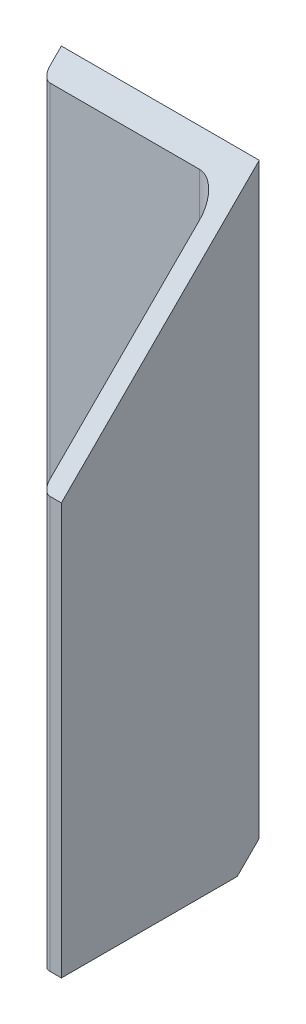
ISO-10303-21;
HEADER;
FILE_DESCRIPTION(('STEP AP214'),'2;1');
FILE_NAME('part.step','',(''),(''),'','','');
FILE_SCHEMA(('AUTOMOTIVE_DESIGN { 1 0 10303 214 1 1 1 1 }'));
ENDSEC;
DATA;
#1=APPLICATION_CONTEXT('core data for automotive mechanical design processes');
#2=APPLICATION_PROTOCOL_DEFINITION('international standard','automotive_design',2000,#1);
#3=PRODUCT_CONTEXT('',#1,'mechanical');
#4=PRODUCT('Part','Part','',(#3));
#5=PRODUCT_RELATED_PRODUCT_CATEGORY('part','',(#4));
#6=PRODUCT_DEFINITION_FORMATION('','',#4);
#7=PRODUCT_DEFINITION_CONTEXT('part definition',#1,'design');
#8=PRODUCT_DEFINITION('design','',#6,#7);
#9=PRODUCT_DEFINITION_SHAPE('','',#8);
#10=(LENGTH_UNIT() NAMED_UNIT(*) SI_UNIT(.MILLI.,.METRE.));
#11=(NAMED_UNIT(*) PLANE_ANGLE_UNIT() SI_UNIT($,.RADIAN.));
#12=(NAMED_UNIT(*) SI_UNIT($,.STERADIAN.) SOLID_ANGLE_UNIT());
#13=UNCERTAINTY_MEASURE_WITH_UNIT(LENGTH_MEASURE(1.E-05),#10,'distance_accuracy_value','');
#14=(GEOMETRIC_REPRESENTATION_CONTEXT(3) GLOBAL_UNCERTAINTY_ASSIGNED_CONTEXT((#13)) GLOBAL_UNIT_ASSIGNED_CONTEXT((#10,
#11,#12)) REPRESENTATION_CONTEXT('',''));
#15=CARTESIAN_POINT('',(0.,0.,0.));
#16=DIRECTION('',(0.,0.,1.));
#17=DIRECTION('',(1.,0.,0.));
#18=AXIS2_PLACEMENT_3D('',#15,#16,#17);
#19=CARTESIAN_POINT('',(-29.1999999999999,5.9999999999999,-490.3));
#20=DIRECTION('',(0.,1.,0.));
#21=DIRECTION('',(0.,0.,-1.));
#22=AXIS2_PLACEMENT_3D('',#19,#20,#21);
#23=PLANE('',#22);
#24=DIRECTION('',(0.,0.,1.));
#25=VECTOR('',#24,1.);
#26=CARTESIAN_POINT('',(31.5000000000001,5.99999999999989,-494.));
#27=LINE('',#26,#25);
#28=CARTESIAN_POINT('',(31.5,5.99999999999991,-487.));
#29=VERTEX_POINT('',#28);
#30=CARTESIAN_POINT('',(31.4999999999996,6.,-431.));
#31=VERTEX_POINT('',#30);
#32=EDGE_CURVE('E118',#29,#31,#27,.T.);
#33=ORIENTED_EDGE('',*,*,#32,.T.);
#34=DIRECTION('',(-1.,0.,0.));
#35=VECTOR('',#34,1.);
#36=CARTESIAN_POINT('',(27.7999999999996,6.,-431.));
#37=LINE('',#36,#35);
#38=CARTESIAN_POINT('',(27.7999999999996,6.,-431.));
#39=VERTEX_POINT('',#38);
#40=EDGE_CURVE('E127',#31,#39,#37,.T.);
#41=ORIENTED_EDGE('',*,*,#40,.T.);
#42=CARTESIAN_POINT('',(27.7999999999997,6.,-433.3));
#43=DIRECTION('',(0.,-1.,0.));
#44=DIRECTION('',(0.,0.,1.));
#45=AXIS2_PLACEMENT_3D('',#42,#43,#44);
#46=CIRCLE('',#45,2.30000000000001);
#47=CARTESIAN_POINT('',(25.4999999999996,6.,-433.3));
#48=VERTEX_POINT('',#47);
#49=EDGE_CURVE('E133',#39,#48,#46,.T.);
#50=ORIENTED_EDGE('',*,*,#49,.T.);
#51=DIRECTION('',(0.,0.,-1.));
#52=VECTOR('',#51,1.);
#53=CARTESIAN_POINT('',(25.5,5.99999999999992,-481.));
#54=LINE('',#53,#52);
#55=CARTESIAN_POINT('',(25.5,5.99999999999992,-481.));
#56=VERTEX_POINT('',#55);
#57=EDGE_CURVE('E145',#48,#56,#54,.T.);
#58=ORIENTED_EDGE('',*,*,#57,.T.);
#59=CARTESIAN_POINT('',(18.5,5.99999999999992,-481.));
#60=DIRECTION('',(0.,1.,0.));
#61=DIRECTION('',(0.,0.,-1.));
#62=AXIS2_PLACEMENT_3D('',#59,#60,#61);
#63=CIRCLE('',#62,7.);
#64=CARTESIAN_POINT('',(22.1055512754641,5.99999999999991,-487.));
#65=VERTEX_POINT('',#64);
#66=EDGE_CURVE('E148',#56,#65,#63,.T.);
#67=ORIENTED_EDGE('',*,*,#66,.T.);
#68=DIRECTION('',(-1.,0.,0.));
#69=VECTOR('',#68,1.);
#70=CARTESIAN_POINT('',(-29.2,5.99999999999991,-487.));
#71=LINE('',#70,#69);
#72=EDGE_CURVE('E138',#29,#65,#71,.T.);
#73=ORIENTED_EDGE('',*,*,#72,.F.);
#74=EDGE_LOOP('',(#33,#41,#50,#58,#67,#73));
#75=FACE_BOUND('',#74,.T.);
#76=ADVANCED_FACE('F36',(#75),#23,.F.);
#77=CARTESIAN_POINT('',(-29.1999999999999,200.,-490.3));
#78=DIRECTION('',(0.,-1.,0.));
#79=DIRECTION('',(0.,0.,1.));
#80=AXIS2_PLACEMENT_3D('',#77,#78,#79);
#81=CYLINDRICAL_SURFACE('',#80,2.29999999999998);
#82=DIRECTION('',(0.,-1.,0.));
#83=VECTOR('',#82,1.);
#84=CARTESIAN_POINT('',(-29.2,200.,-488.));
#85=LINE('',#84,#83);
#86=CARTESIAN_POINT('',(-29.2,194.000000000001,-488.));
#87=VERTEX_POINT('',#86);
#88=CARTESIAN_POINT('',(-29.2,6.99999999999995,-488.));
#89=VERTEX_POINT('',#88);
#90=EDGE_CURVE('E153',#87,#89,#85,.T.);
#91=ORIENTED_EDGE('',*,*,#90,.F.);
#92=CARTESIAN_POINT('',(-29.1999999999999,196.300000000001,-490.3));
#93=DIRECTION('',(0.,0.707106781186548,0.707106781186547));
#94=DIRECTION('',(0.,-0.707106781186547,0.707106781186548));
#95=AXIS2_PLACEMENT_3D('',#92,#93,#94);
#96=ELLIPSE('',#95,3.2526911934581,2.29999999999998);
#97=CARTESIAN_POINT('',(-31.4999999999999,196.300000000001,-490.3));
#98=VERTEX_POINT('',#97);
#99=EDGE_CURVE('E168',#98,#87,#96,.T.);
#100=ORIENTED_EDGE('',*,*,#99,.F.);
#101=DIRECTION('',(0.,-1.,0.));
#102=VECTOR('',#101,1.);
#103=CARTESIAN_POINT('',(-31.4999999999999,200.,-490.3));
#104=LINE('',#103,#102);
#105=CARTESIAN_POINT('',(-31.4999999999999,9.29999999999998,-490.3));
#106=VERTEX_POINT('',#105);
#107=EDGE_CURVE('E150',#98,#106,#104,.T.);
#108=ORIENTED_EDGE('',*,*,#107,.T.);
#109=CARTESIAN_POINT('',(-29.1999999999999,9.29999999999998,-490.3));
#110=DIRECTION('',(0.,-0.707106781186544,-0.70710678118655));
#111=DIRECTION('',(0.,-0.707106781186551,0.707106781186544));
#112=AXIS2_PLACEMENT_3D('',#109,#110,#111);
#113=ELLIPSE('',#112,3.25269119345811,2.29999999999998);
#114=EDGE_CURVE('E44',#89,#106,#113,.T.);
#115=ORIENTED_EDGE('',*,*,#114,.F.);
#116=EDGE_LOOP('',(#91,#100,#108,#115));
#117=FACE_BOUND('',#116,.T.);
#118=ADVANCED_FACE('F183',(#117),#81,.T.);
#119=CARTESIAN_POINT('',(-29.2,200.,-488.));
#120=DIRECTION('',(0.,0.,-1.));
#121=DIRECTION('',(1.,0.,0.));
#122=AXIS2_PLACEMENT_3D('',#119,#120,#121);
#123=PLANE('',#122);
#124=DIRECTION('',(0.,-1.,0.));
#125=VECTOR('',#124,1.);
#126=CARTESIAN_POINT('',(18.5,200.,-488.));
#127=LINE('',#126,#125);
#128=CARTESIAN_POINT('',(18.5,194.,-488.));
#129=VERTEX_POINT('',#128);
#130=CARTESIAN_POINT('',(18.5,7.00000000000001,-488.));
#131=VERTEX_POINT('',#130);
#132=EDGE_CURVE('E156',#129,#131,#127,.T.);
#133=ORIENTED_EDGE('',*,*,#132,.F.);
#134=DIRECTION('',(1.,0.,0.));
#135=VECTOR('',#134,1.);
#136=CARTESIAN_POINT('',(-29.2,194.000000000001,-488.));
#137=LINE('',#136,#135);
#138=EDGE_CURVE('E171',#87,#129,#137,.T.);
#139=ORIENTED_EDGE('',*,*,#138,.F.);
#140=ORIENTED_EDGE('',*,*,#90,.T.);
#141=DIRECTION('',(1.,0.,0.));
#142=VECTOR('',#141,1.);
#143=CARTESIAN_POINT('',(-31.5,6.99999999999997,-488.));
#144=LINE('',#143,#142);
#145=EDGE_CURVE('E56',#131,#89,#144,.F.);
#146=ORIENTED_EDGE('',*,*,#145,.F.);
#147=EDGE_LOOP('',(#133,#139,#140,#146));
#148=FACE_BOUND('',#147,.T.);
#149=ADVANCED_FACE('F202',(#148),#123,.F.);
#150=CARTESIAN_POINT('',(18.5,200.,-481.));
#151=DIRECTION('',(0.,-1.,0.));
#152=DIRECTION('',(0.,0.,1.));
#153=AXIS2_PLACEMENT_3D('',#150,#151,#152);
#154=CYLINDRICAL_SURFACE('',#153,7.);
#155=ORIENTED_EDGE('',*,*,#66,.F.);
#156=DIRECTION('',(0.,-1.,0.));
#157=VECTOR('',#156,1.);
#158=CARTESIAN_POINT('',(25.5,200.,-481.));
#159=LINE('',#158,#157);
#160=CARTESIAN_POINT('',(25.5,187.,-481.));
#161=VERTEX_POINT('',#160);
#162=EDGE_CURVE('E159',#161,#56,#159,.T.);
#163=ORIENTED_EDGE('',*,*,#162,.F.);
#164=CARTESIAN_POINT('',(18.5,187.,-481.));
#165=DIRECTION('',(0.,0.707106781186548,0.707106781186547));
#166=DIRECTION('',(0.,-0.707106781186547,0.707106781186548));
#167=AXIS2_PLACEMENT_3D('',#164,#165,#166);
#168=ELLIPSE('',#167,9.89949493661168,7.);
#169=EDGE_CURVE('E199',#129,#161,#168,.F.);
#170=ORIENTED_EDGE('',*,*,#169,.F.);
#171=ORIENTED_EDGE('',*,*,#132,.T.);
#172=CARTESIAN_POINT('',(18.5,-1.11022302462516E-13,-481.));
#173=DIRECTION('',(0.,-0.707106781186544,-0.70710678118655));
#174=DIRECTION('',(0.,-0.707106781186551,0.707106781186544));
#175=AXIS2_PLACEMENT_3D('',#172,#173,#174);
#176=ELLIPSE('',#175,9.89949493661173,7.);
#177=EDGE_CURVE('E177',#65,#131,#176,.F.);
#178=ORIENTED_EDGE('',*,*,#177,.F.);
#179=EDGE_LOOP('',(#155,#163,#170,#171,#178));
#180=FACE_BOUND('',#179,.T.);
#181=ADVANCED_FACE('F196',(#180),#154,.F.);
#182=CARTESIAN_POINT('',(25.5,200.,-481.));
#183=DIRECTION('',(1.,0.,0.));
#184=DIRECTION('',(0.,0.,1.));
#185=AXIS2_PLACEMENT_3D('',#182,#183,#184);
#186=PLANE('',#185);
#187=ORIENTED_EDGE('',*,*,#162,.T.);
#188=ORIENTED_EDGE('',*,*,#57,.F.);
#189=DIRECTION('',(0.,-1.,0.));
#190=VECTOR('',#189,1.);
#191=CARTESIAN_POINT('',(25.4999999999996,200.,-433.3));
#192=LINE('',#191,#190);
#193=CARTESIAN_POINT('',(25.4999999999997,139.3,-433.3));
#194=VERTEX_POINT('',#193);
#195=EDGE_CURVE('E161',#194,#48,#192,.T.);
#196=ORIENTED_EDGE('',*,*,#195,.F.);
#197=DIRECTION('',(0.,-0.707106781186547,0.707106781186548));
#198=VECTOR('',#197,1.);
#199=CARTESIAN_POINT('',(25.5,193.5,-487.5));
#200=LINE('',#199,#198);
#201=EDGE_CURVE('E204',#161,#194,#200,.T.);
#202=ORIENTED_EDGE('',*,*,#201,.F.);
#203=EDGE_LOOP('',(#187,#188,#196,#202));
#204=FACE_BOUND('',#203,.T.);
#205=ADVANCED_FACE('F218',(#204),#186,.F.);
#206=CARTESIAN_POINT('',(27.7999999999997,200.,-433.3));
#207=DIRECTION('',(0.,-1.,0.));
#208=DIRECTION('',(0.,0.,1.));
#209=AXIS2_PLACEMENT_3D('',#206,#207,#208);
#210=CYLINDRICAL_SURFACE('',#209,2.30000000000001);
#211=ORIENTED_EDGE('',*,*,#195,.T.);
#212=ORIENTED_EDGE('',*,*,#49,.F.);
#213=DIRECTION('',(0.,-1.,0.));
#214=VECTOR('',#213,1.);
#215=CARTESIAN_POINT('',(27.7999999999996,200.,-431.));
#216=LINE('',#215,#214);
#217=CARTESIAN_POINT('',(27.7999999999996,137.,-431.));
#218=VERTEX_POINT('',#217);
#219=EDGE_CURVE('E124',#218,#39,#216,.T.);
#220=ORIENTED_EDGE('',*,*,#219,.F.);
#221=CARTESIAN_POINT('',(27.7999999999997,139.3,-433.3));
#222=DIRECTION('',(0.,0.707106781186548,0.707106781186547));
#223=DIRECTION('',(0.,-0.707106781186547,0.707106781186548));
#224=AXIS2_PLACEMENT_3D('',#221,#222,#223);
#225=ELLIPSE('',#224,3.25269119345814,2.30000000000001);
#226=EDGE_CURVE('E209',#194,#218,#225,.T.);
#227=ORIENTED_EDGE('',*,*,#226,.F.);
#228=EDGE_LOOP('',(#211,#212,#220,#227));
#229=FACE_BOUND('',#228,.T.);
#230=ADVANCED_FACE('F216',(#229),#210,.T.);
#231=CARTESIAN_POINT('',(27.7999999999996,200.,-431.));
#232=DIRECTION('',(0.,0.,-1.));
#233=DIRECTION('',(0.,-1.,0.));
#234=AXIS2_PLACEMENT_3D('',#231,#232,#233);
#235=PLANE('',#234);
#236=ORIENTED_EDGE('',*,*,#219,.T.);
#237=ORIENTED_EDGE('',*,*,#40,.F.);
#238=DIRECTION('',(0.,-1.,0.));
#239=VECTOR('',#238,1.);
#240=CARTESIAN_POINT('',(31.4999999999996,200.,-431.));
#241=LINE('',#240,#239);
#242=CARTESIAN_POINT('',(31.4999999999996,137.,-431.));
#243=VERTEX_POINT('',#242);
#244=EDGE_CURVE('E112',#243,#31,#241,.T.);
#245=ORIENTED_EDGE('',*,*,#244,.F.);
#246=DIRECTION('',(1.,0.,0.));
#247=VECTOR('',#246,1.);
#248=CARTESIAN_POINT('',(27.7999999999996,137.,-431.));
#249=LINE('',#248,#247);
#250=EDGE_CURVE('E212',#218,#243,#249,.T.);
#251=ORIENTED_EDGE('',*,*,#250,.F.);
#252=EDGE_LOOP('',(#236,#237,#245,#251));
#253=FACE_BOUND('',#252,.T.);
#254=ADVANCED_FACE('F128',(#253),#235,.F.);
#255=CARTESIAN_POINT('',(31.5000000000001,200.,-494.));
#256=DIRECTION('',(-1.,0.,0.));
#257=DIRECTION('',(0.,0.,-1.));
#258=AXIS2_PLACEMENT_3D('',#255,#256,#257);
#259=PLANE('',#258);
#260=DIRECTION('',(0.,-1.,0.));
#261=VECTOR('',#260,1.);
#262=CARTESIAN_POINT('',(31.5000000000001,200.,-494.));
#263=LINE('',#262,#261);
#264=CARTESIAN_POINT('',(31.5000000000001,200.000000000002,-494.000000000002));
#265=VERTEX_POINT('',#264);
#266=CARTESIAN_POINT('',(31.5000000000001,13.,-494.));
#267=VERTEX_POINT('',#266);
#268=EDGE_CURVE('E123',#265,#267,#263,.T.);
#269=ORIENTED_EDGE('',*,*,#268,.F.);
#270=DIRECTION('',(0.,0.707106781186547,-0.707106781186548));
#271=VECTOR('',#270,1.);
#272=CARTESIAN_POINT('',(31.5000000000001,200.,-494.));
#273=LINE('',#272,#271);
#274=EDGE_CURVE('E120',#243,#265,#273,.T.);
#275=ORIENTED_EDGE('',*,*,#274,.F.);
#276=ORIENTED_EDGE('',*,*,#244,.T.);
#277=ORIENTED_EDGE('',*,*,#32,.F.);
#278=DIRECTION('',(0.,0.707106781186551,-0.707106781186544));
#279=VECTOR('',#278,1.);
#280=CARTESIAN_POINT('',(31.5000000000001,13.,-494.));
#281=LINE('',#280,#279);
#282=EDGE_CURVE('E174',#267,#29,#281,.F.);
#283=ORIENTED_EDGE('',*,*,#282,.F.);
#284=EDGE_LOOP('',(#269,#275,#276,#277,#283));
#285=FACE_BOUND('',#284,.T.);
#286=ADVANCED_FACE('F115',(#285),#259,.F.);
#287=CARTESIAN_POINT('',(-31.4999999999999,200.,-494.));
#288=DIRECTION('',(0.,0.,1.));
#289=DIRECTION('',(-1.,0.,0.));
#290=AXIS2_PLACEMENT_3D('',#287,#288,#289);
#291=PLANE('',#290);
#292=DIRECTION('',(0.,-1.,0.));
#293=VECTOR('',#292,1.);
#294=CARTESIAN_POINT('',(-31.4999999999999,200.,-494.));
#295=LINE('',#294,#293);
#296=CARTESIAN_POINT('',(-31.4999999999999,200.,-494.));
#297=VERTEX_POINT('',#296);
#298=CARTESIAN_POINT('',(-31.4999999999999,13.,-494.));
#299=VERTEX_POINT('',#298);
#300=EDGE_CURVE('E166',#297,#299,#295,.T.);
#301=ORIENTED_EDGE('',*,*,#300,.F.);
#302=DIRECTION('',(-1.,0.,0.));
#303=VECTOR('',#302,1.);
#304=CARTESIAN_POINT('',(-31.4999999999999,200.,-494.));
#305=LINE('',#304,#303);
#306=EDGE_CURVE('E188',#265,#297,#305,.T.);
#307=ORIENTED_EDGE('',*,*,#306,.F.);
#308=ORIENTED_EDGE('',*,*,#268,.T.);
#309=DIRECTION('',(1.,0.,0.));
#310=VECTOR('',#309,1.);
#311=CARTESIAN_POINT('',(-31.4999999999999,13.,-494.));
#312=LINE('',#311,#310);
#313=EDGE_CURVE('E172',#299,#267,#312,.T.);
#314=ORIENTED_EDGE('',*,*,#313,.F.);
#315=EDGE_LOOP('',(#301,#307,#308,#314));
#316=FACE_BOUND('',#315,.T.);
#317=ADVANCED_FACE('F191',(#316),#291,.F.);
#318=CARTESIAN_POINT('',(-31.4999999999999,200.,-494.));
#319=DIRECTION('',(1.,0.,0.));
#320=DIRECTION('',(0.,0.,1.));
#321=AXIS2_PLACEMENT_3D('',#318,#319,#320);
#322=PLANE('',#321);
#323=ORIENTED_EDGE('',*,*,#107,.F.);
#324=DIRECTION('',(0.,-0.707106781186547,0.707106781186548));
#325=VECTOR('',#324,1.);
#326=CARTESIAN_POINT('',(-31.4999999999999,200.,-494.));
#327=LINE('',#326,#325);
#328=EDGE_CURVE('E141',#297,#98,#327,.T.);
#329=ORIENTED_EDGE('',*,*,#328,.F.);
#330=ORIENTED_EDGE('',*,*,#300,.T.);
#331=DIRECTION('',(0.,-0.707106781186551,0.707106781186544));
#332=VECTOR('',#331,1.);
#333=CARTESIAN_POINT('',(-31.4999999999999,13.,-494.));
#334=LINE('',#333,#332);
#335=EDGE_CURVE('E11',#106,#299,#334,.F.);
#336=ORIENTED_EDGE('',*,*,#335,.F.);
#337=EDGE_LOOP('',(#323,#329,#330,#336));
#338=FACE_BOUND('',#337,.T.);
#339=ADVANCED_FACE('F184',(#338),#322,.F.);
#340=CARTESIAN_POINT('',(13.7376133090045,182.237613309005,-476.237613309004));
#341=DIRECTION('',(0.,-0.707106781186548,-0.707106781186547));
#342=DIRECTION('',(0.,-0.707106781186547,0.707106781186548));
#343=AXIS2_PLACEMENT_3D('',#340,#341,#342);
#344=PLANE('',#343);
#345=ORIENTED_EDGE('',*,*,#306,.T.);
#346=ORIENTED_EDGE('',*,*,#328,.T.);
#347=ORIENTED_EDGE('',*,*,#99,.T.);
#348=ORIENTED_EDGE('',*,*,#138,.T.);
#349=ORIENTED_EDGE('',*,*,#169,.T.);
#350=ORIENTED_EDGE('',*,*,#201,.T.);
#351=ORIENTED_EDGE('',*,*,#226,.T.);
#352=ORIENTED_EDGE('',*,*,#250,.T.);
#353=ORIENTED_EDGE('',*,*,#274,.T.);
#354=EDGE_LOOP('',(#345,#346,#347,#348,#349,#350,#351,#352,#353));
#355=FACE_BOUND('',#354,.T.);
#356=ADVANCED_FACE('F189',(#355),#344,.F.);
#357=CARTESIAN_POINT('',(-31.4999999999999,13.,-494.));
#358=DIRECTION('',(0.,0.707106781186544,0.70710678118655));
#359=DIRECTION('',(1.,0.,0.));
#360=AXIS2_PLACEMENT_3D('',#357,#358,#359);
#361=PLANE('',#360);
#362=ORIENTED_EDGE('',*,*,#177,.T.);
#363=ORIENTED_EDGE('',*,*,#145,.T.);
#364=ORIENTED_EDGE('',*,*,#114,.T.);
#365=ORIENTED_EDGE('',*,*,#335,.T.);
#366=ORIENTED_EDGE('',*,*,#313,.T.);
#367=ORIENTED_EDGE('',*,*,#282,.T.);
#368=ORIENTED_EDGE('',*,*,#72,.T.);
#369=EDGE_LOOP('',(#362,#363,#364,#365,#366,#367,#368));
#370=FACE_BOUND('',#369,.T.);
#371=ADVANCED_FACE('F38',(#370),#361,.F.);
#372=CLOSED_SHELL('',(#76,#118,#149,#181,#205,#230,#254,#286,#317,#339,#356,#371));
#373=MANIFOLD_SOLID_BREP('B2',#372);
#374=ADVANCED_BREP_SHAPE_REPRESENTATION('',(#18,#373),#14);
#375=SHAPE_DEFINITION_REPRESENTATION(#9,#374);
ENDSEC;
END-ISO-10303-21;
